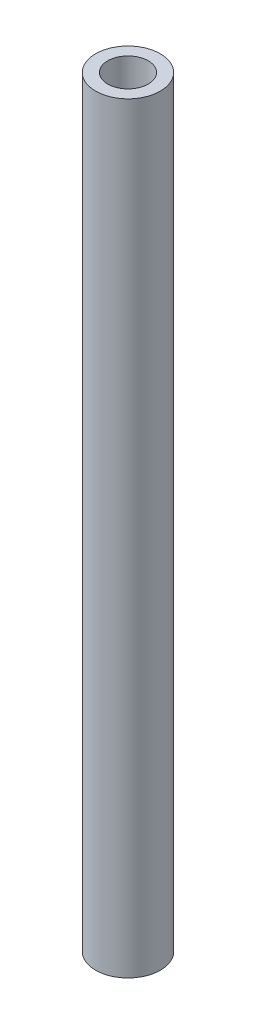
ISO-10303-21;
HEADER;
FILE_DESCRIPTION(('STEP AP214'),'2;1');
FILE_NAME('part.step','',(''),(''),'','','');
FILE_SCHEMA(('AUTOMOTIVE_DESIGN { 1 0 10303 214 1 1 1 1 }'));
ENDSEC;
DATA;
#1=APPLICATION_CONTEXT('core data for automotive mechanical design processes');
#2=APPLICATION_PROTOCOL_DEFINITION('international standard','automotive_design',2000,#1);
#3=PRODUCT_CONTEXT('',#1,'mechanical');
#4=PRODUCT('Part','Part','',(#3));
#5=PRODUCT_RELATED_PRODUCT_CATEGORY('part','',(#4));
#6=PRODUCT_DEFINITION_FORMATION('','',#4);
#7=PRODUCT_DEFINITION_CONTEXT('part definition',#1,'design');
#8=PRODUCT_DEFINITION('design','',#6,#7);
#9=PRODUCT_DEFINITION_SHAPE('','',#8);
#10=(LENGTH_UNIT() NAMED_UNIT(*) SI_UNIT(.MILLI.,.METRE.));
#11=(NAMED_UNIT(*) PLANE_ANGLE_UNIT() SI_UNIT($,.RADIAN.));
#12=(NAMED_UNIT(*) SI_UNIT($,.STERADIAN.) SOLID_ANGLE_UNIT());
#13=UNCERTAINTY_MEASURE_WITH_UNIT(LENGTH_MEASURE(1.E-05),#10,'distance_accuracy_value','');
#14=(GEOMETRIC_REPRESENTATION_CONTEXT(3) GLOBAL_UNCERTAINTY_ASSIGNED_CONTEXT((#13)) GLOBAL_UNIT_ASSIGNED_CONTEXT((#10,
#11,#12)) REPRESENTATION_CONTEXT('',''));
#15=CARTESIAN_POINT('',(0.,0.,0.));
#16=DIRECTION('',(0.,0.,1.));
#17=DIRECTION('',(1.,0.,0.));
#18=AXIS2_PLACEMENT_3D('',#15,#16,#17);
#19=CARTESIAN_POINT('',(0.,94.1,0.));
#20=DIRECTION('',(0.,1.,0.));
#21=DIRECTION('',(0.,0.,1.));
#22=AXIS2_PLACEMENT_3D('',#19,#20,#21);
#23=PLANE('',#22);
#24=CARTESIAN_POINT('',(0.,94.1,0.));
#25=DIRECTION('',(0.,1.,0.));
#26=DIRECTION('',(0.,0.,1.));
#27=AXIS2_PLACEMENT_3D('',#24,#25,#26);
#28=CIRCLE('',#27,4.);
#29=CARTESIAN_POINT('',(0.,94.1,4.));
#30=VERTEX_POINT('',#29);
#31=EDGE_CURVE('E10',#30,#30,#28,.T.);
#32=ORIENTED_EDGE('',*,*,#31,.T.);
#33=EDGE_LOOP('',(#32));
#34=FACE_BOUND('',#33,.T.);
#35=CARTESIAN_POINT('',(0.,94.1,0.));
#36=DIRECTION('',(0.,1.,0.));
#37=DIRECTION('',(0.,0.,1.));
#38=AXIS2_PLACEMENT_3D('',#35,#36,#37);
#39=CIRCLE('',#38,2.5);
#40=CARTESIAN_POINT('',(0.,94.1,2.5));
#41=VERTEX_POINT('',#40);
#42=EDGE_CURVE('E50',#41,#41,#39,.T.);
#43=ORIENTED_EDGE('',*,*,#42,.F.);
#44=EDGE_LOOP('',(#43));
#45=FACE_BOUND('',#44,.T.);
#46=ADVANCED_FACE('F37',(#34,#45),#23,.T.);
#47=CARTESIAN_POINT('',(0.,0.,0.));
#48=DIRECTION('',(0.,1.,0.));
#49=DIRECTION('',(0.,0.,1.));
#50=AXIS2_PLACEMENT_3D('',#47,#48,#49);
#51=PLANE('',#50);
#52=CARTESIAN_POINT('',(0.,0.,0.));
#53=DIRECTION('',(0.,1.,0.));
#54=DIRECTION('',(0.,0.,1.));
#55=AXIS2_PLACEMENT_3D('',#52,#53,#54);
#56=CIRCLE('',#55,4.);
#57=CARTESIAN_POINT('',(0.,0.,4.));
#58=VERTEX_POINT('',#57);
#59=EDGE_CURVE('E41',#58,#58,#56,.T.);
#60=ORIENTED_EDGE('',*,*,#59,.F.);
#61=EDGE_LOOP('',(#60));
#62=FACE_BOUND('',#61,.T.);
#63=CARTESIAN_POINT('',(0.,0.,0.));
#64=DIRECTION('',(0.,1.,0.));
#65=DIRECTION('',(0.,0.,1.));
#66=AXIS2_PLACEMENT_3D('',#63,#64,#65);
#67=CIRCLE('',#66,2.5);
#68=CARTESIAN_POINT('',(0.,0.,2.5));
#69=VERTEX_POINT('',#68);
#70=EDGE_CURVE('E52',#69,#69,#67,.T.);
#71=ORIENTED_EDGE('',*,*,#70,.T.);
#72=EDGE_LOOP('',(#71));
#73=FACE_BOUND('',#72,.T.);
#74=ADVANCED_FACE('F64',(#62,#73),#51,.F.);
#75=CARTESIAN_POINT('',(0.,94.1,0.));
#76=DIRECTION('',(0.,-1.,0.));
#77=DIRECTION('',(0.,0.,-1.));
#78=AXIS2_PLACEMENT_3D('',#75,#76,#77);
#79=CYLINDRICAL_SURFACE('',#78,4.);
#80=ORIENTED_EDGE('',*,*,#31,.F.);
#81=EDGE_LOOP('',(#80));
#82=FACE_BOUND('',#81,.T.);
#83=ORIENTED_EDGE('',*,*,#59,.T.);
#84=EDGE_LOOP('',(#83));
#85=FACE_BOUND('',#84,.T.);
#86=ADVANCED_FACE('F39',(#82,#85),#79,.T.);
#87=CARTESIAN_POINT('',(0.,94.1,0.));
#88=DIRECTION('',(0.,-1.,0.));
#89=DIRECTION('',(0.,0.,-1.));
#90=AXIS2_PLACEMENT_3D('',#87,#88,#89);
#91=CYLINDRICAL_SURFACE('',#90,2.5);
#92=ORIENTED_EDGE('',*,*,#42,.T.);
#93=EDGE_LOOP('',(#92));
#94=FACE_BOUND('',#93,.T.);
#95=ORIENTED_EDGE('',*,*,#70,.F.);
#96=EDGE_LOOP('',(#95));
#97=FACE_BOUND('',#96,.T.);
#98=ADVANCED_FACE('F60',(#94,#97),#91,.F.);
#99=CLOSED_SHELL('',(#46,#74,#86,#98));
#100=MANIFOLD_SOLID_BREP('B2',#99);
#101=ADVANCED_BREP_SHAPE_REPRESENTATION('',(#18,#100),#14);
#102=SHAPE_DEFINITION_REPRESENTATION(#9,#101);
ENDSEC;
END-ISO-10303-21;
